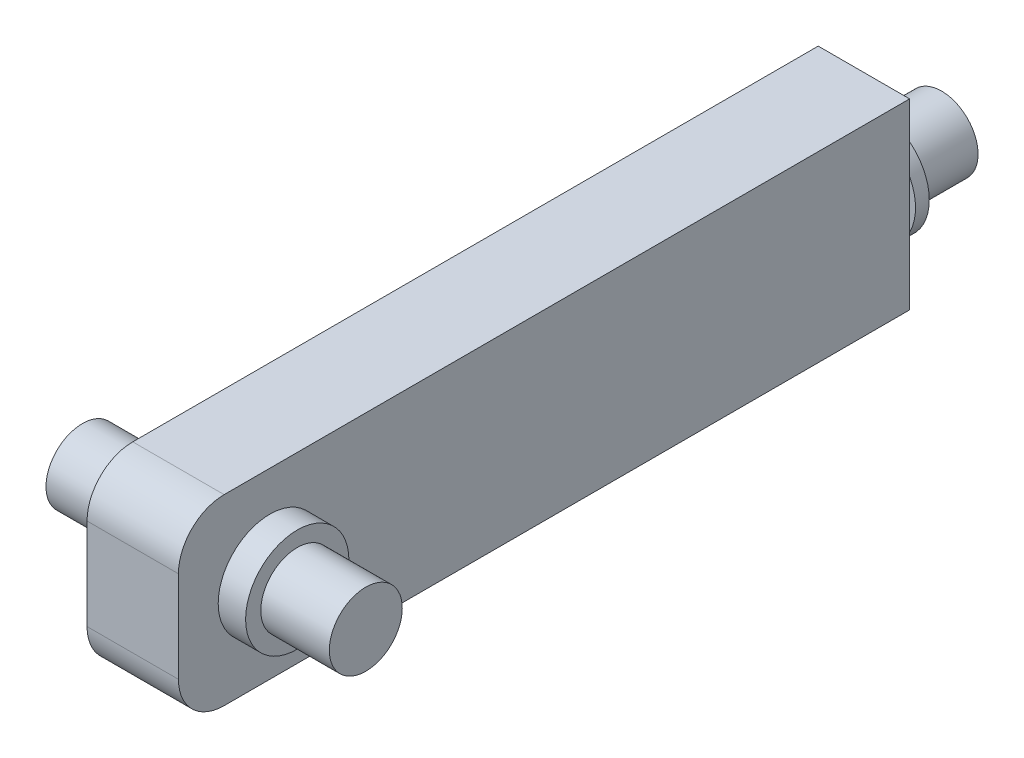
ISO-10303-21;
HEADER;
FILE_DESCRIPTION(('STEP AP214'),'2;1');
FILE_NAME('part.step','',(''),(''),'','','');
FILE_SCHEMA(('AUTOMOTIVE_DESIGN { 1 0 10303 214 1 1 1 1 }'));
ENDSEC;
DATA;
#1=APPLICATION_CONTEXT('core data for automotive mechanical design processes');
#2=APPLICATION_PROTOCOL_DEFINITION('international standard','automotive_design',2000,#1);
#3=PRODUCT_CONTEXT('',#1,'mechanical');
#4=PRODUCT('Part','Part','',(#3));
#5=PRODUCT_RELATED_PRODUCT_CATEGORY('part','',(#4));
#6=PRODUCT_DEFINITION_FORMATION('','',#4);
#7=PRODUCT_DEFINITION_CONTEXT('part definition',#1,'design');
#8=PRODUCT_DEFINITION('design','',#6,#7);
#9=PRODUCT_DEFINITION_SHAPE('','',#8);
#10=(LENGTH_UNIT() NAMED_UNIT(*) SI_UNIT(.MILLI.,.METRE.));
#11=(NAMED_UNIT(*) PLANE_ANGLE_UNIT() SI_UNIT($,.RADIAN.));
#12=(NAMED_UNIT(*) SI_UNIT($,.STERADIAN.) SOLID_ANGLE_UNIT());
#13=UNCERTAINTY_MEASURE_WITH_UNIT(LENGTH_MEASURE(1.E-05),#10,'distance_accuracy_value','');
#14=(GEOMETRIC_REPRESENTATION_CONTEXT(3) GLOBAL_UNCERTAINTY_ASSIGNED_CONTEXT((#13)) GLOBAL_UNIT_ASSIGNED_CONTEXT((#10,
#11,#12)) REPRESENTATION_CONTEXT('',''));
#15=CARTESIAN_POINT('',(0.,0.,0.));
#16=DIRECTION('',(0.,0.,1.));
#17=DIRECTION('',(1.,0.,0.));
#18=AXIS2_PLACEMENT_3D('',#15,#16,#17);
#19=CARTESIAN_POINT('',(0.,20.,-80.));
#20=DIRECTION('',(0.,0.,1.));
#21=DIRECTION('',(1.,0.,0.));
#22=AXIS2_PLACEMENT_3D('',#19,#20,#21);
#23=PLANE('',#22);
#24=CARTESIAN_POINT('',(5.,10.,-80.));
#25=DIRECTION('',(0.,0.,-1.));
#26=DIRECTION('',(-1.,0.,0.));
#27=AXIS2_PLACEMENT_3D('',#24,#25,#26);
#28=CIRCLE('',#27,5.65);
#29=CARTESIAN_POINT('',(10.,7.36893557661543,-80.));
#30=VERTEX_POINT('',#29);
#31=CARTESIAN_POINT('',(0.,7.36893557661543,-80.));
#32=VERTEX_POINT('',#31);
#33=EDGE_CURVE('E50',#30,#32,#28,.T.);
#34=ORIENTED_EDGE('',*,*,#33,.F.);
#35=DIRECTION('',(0.,-1.,0.));
#36=VECTOR('',#35,1.);
#37=CARTESIAN_POINT('',(10.,20.,-80.));
#38=LINE('',#37,#36);
#39=CARTESIAN_POINT('',(10.,0.,-80.));
#40=VERTEX_POINT('',#39);
#41=EDGE_CURVE('E110',#30,#40,#38,.T.);
#42=ORIENTED_EDGE('',*,*,#41,.T.);
#43=DIRECTION('',(-1.,0.,0.));
#44=VECTOR('',#43,1.);
#45=CARTESIAN_POINT('',(0.,0.,-80.));
#46=LINE('',#45,#44);
#47=CARTESIAN_POINT('',(0.,0.,-80.));
#48=VERTEX_POINT('',#47);
#49=EDGE_CURVE('E416',#40,#48,#46,.T.);
#50=ORIENTED_EDGE('',*,*,#49,.T.);
#51=DIRECTION('',(0.,-1.,0.));
#52=VECTOR('',#51,1.);
#53=CARTESIAN_POINT('',(0.,20.,-80.));
#54=LINE('',#53,#52);
#55=EDGE_CURVE('E55',#32,#48,#54,.T.);
#56=ORIENTED_EDGE('',*,*,#55,.F.);
#57=EDGE_LOOP('',(#34,#42,#50,#56));
#58=FACE_BOUND('',#57,.T.);
#59=ADVANCED_FACE('F35',(#58),#23,.F.);
#60=CARTESIAN_POINT('',(0.,20.,0.));
#61=DIRECTION('',(1.,0.,0.));
#62=DIRECTION('',(0.,0.,-1.));
#63=AXIS2_PLACEMENT_3D('',#60,#61,#62);
#64=PLANE('',#63);
#65=CARTESIAN_POINT('',(0.,10.,-10.));
#66=DIRECTION('',(1.,0.,0.));
#67=DIRECTION('',(0.,0.,-1.));
#68=AXIS2_PLACEMENT_3D('',#65,#66,#67);
#69=CIRCLE('',#68,5.65);
#70=CARTESIAN_POINT('',(0.,10.,-15.65));
#71=VERTEX_POINT('',#70);
#72=EDGE_CURVE('E11',#71,#71,#69,.F.);
#73=ORIENTED_EDGE('',*,*,#72,.F.);
#74=EDGE_LOOP('',(#73));
#75=FACE_BOUND('',#74,.T.);
#76=DIRECTION('',(0.,0.,1.));
#77=VECTOR('',#76,1.);
#78=CARTESIAN_POINT('',(0.,0.,0.));
#79=LINE('',#78,#77);
#80=CARTESIAN_POINT('',(0.,0.,-5.));
#81=VERTEX_POINT('',#80);
#82=EDGE_CURVE('E183',#48,#81,#79,.T.);
#83=ORIENTED_EDGE('',*,*,#82,.T.);
#84=CARTESIAN_POINT('',(0.,5.,-5.));
#85=DIRECTION('',(1.,0.,0.));
#86=DIRECTION('',(0.,0.,-1.));
#87=AXIS2_PLACEMENT_3D('',#84,#85,#86);
#88=CIRCLE('',#87,5.);
#89=CARTESIAN_POINT('',(0.,5.,0.));
#90=VERTEX_POINT('',#89);
#91=EDGE_CURVE('E186',#81,#90,#88,.F.);
#92=ORIENTED_EDGE('',*,*,#91,.T.);
#93=DIRECTION('',(0.,-1.,0.));
#94=VECTOR('',#93,1.);
#95=CARTESIAN_POINT('',(0.,20.,0.));
#96=LINE('',#95,#94);
#97=CARTESIAN_POINT('',(0.,15.,0.));
#98=VERTEX_POINT('',#97);
#99=EDGE_CURVE('E414',#98,#90,#96,.T.);
#100=ORIENTED_EDGE('',*,*,#99,.F.);
#101=CARTESIAN_POINT('',(0.,15.,-5.));
#102=DIRECTION('',(1.,0.,0.));
#103=DIRECTION('',(0.,0.,-1.));
#104=AXIS2_PLACEMENT_3D('',#101,#102,#103);
#105=CIRCLE('',#104,5.);
#106=CARTESIAN_POINT('',(0.,20.,-5.));
#107=VERTEX_POINT('',#106);
#108=EDGE_CURVE('E201',#98,#107,#105,.F.);
#109=ORIENTED_EDGE('',*,*,#108,.T.);
#110=DIRECTION('',(0.,0.,1.));
#111=VECTOR('',#110,1.);
#112=CARTESIAN_POINT('',(0.,20.,0.));
#113=LINE('',#112,#111);
#114=CARTESIAN_POINT('',(0.,20.,-80.));
#115=VERTEX_POINT('',#114);
#116=EDGE_CURVE('E413',#115,#107,#113,.T.);
#117=ORIENTED_EDGE('',*,*,#116,.F.);
#118=CARTESIAN_POINT('',(0.,12.6310644233846,-80.));
#119=VERTEX_POINT('',#118);
#120=EDGE_CURVE('E425',#115,#119,#54,.T.);
#121=ORIENTED_EDGE('',*,*,#120,.T.);
#122=DIRECTION('',(0.,1.,0.));
#123=VECTOR('',#122,1.);
#124=CARTESIAN_POINT('',(0.,20.,-80.));
#125=LINE('',#124,#123);
#126=EDGE_CURVE('E120',#32,#119,#125,.T.);
#127=ORIENTED_EDGE('',*,*,#126,.F.);
#128=ORIENTED_EDGE('',*,*,#55,.T.);
#129=EDGE_LOOP('',(#83,#92,#100,#109,#117,#121,#127,#128));
#130=FACE_BOUND('',#129,.T.);
#131=ADVANCED_FACE('F176',(#75,#130),#64,.F.);
#132=CARTESIAN_POINT('',(0.,20.,0.));
#133=DIRECTION('',(0.,0.,-1.));
#134=DIRECTION('',(-1.,0.,0.));
#135=AXIS2_PLACEMENT_3D('',#132,#133,#134);
#136=PLANE('',#135);
#137=ORIENTED_EDGE('',*,*,#99,.T.);
#138=DIRECTION('',(1.,0.,0.));
#139=VECTOR('',#138,1.);
#140=CARTESIAN_POINT('',(10.,5.,0.));
#141=LINE('',#140,#139);
#142=CARTESIAN_POINT('',(10.,5.,0.));
#143=VERTEX_POINT('',#142);
#144=EDGE_CURVE('E199',#90,#143,#141,.T.);
#145=ORIENTED_EDGE('',*,*,#144,.T.);
#146=DIRECTION('',(0.,-1.,0.));
#147=VECTOR('',#146,1.);
#148=CARTESIAN_POINT('',(10.,20.,0.));
#149=LINE('',#148,#147);
#150=CARTESIAN_POINT('',(10.,15.,0.));
#151=VERTEX_POINT('',#150);
#152=EDGE_CURVE('E109',#151,#143,#149,.T.);
#153=ORIENTED_EDGE('',*,*,#152,.F.);
#154=DIRECTION('',(1.,0.,0.));
#155=VECTOR('',#154,1.);
#156=CARTESIAN_POINT('',(0.,15.,0.));
#157=LINE('',#156,#155);
#158=EDGE_CURVE('E410',#151,#98,#157,.F.);
#159=ORIENTED_EDGE('',*,*,#158,.T.);
#160=EDGE_LOOP('',(#137,#145,#153,#159));
#161=FACE_BOUND('',#160,.T.);
#162=ADVANCED_FACE('F179',(#161),#136,.F.);
#163=CARTESIAN_POINT('',(10.,20.,0.));
#164=DIRECTION('',(-1.,0.,0.));
#165=DIRECTION('',(0.,0.,1.));
#166=AXIS2_PLACEMENT_3D('',#163,#164,#165);
#167=PLANE('',#166);
#168=CARTESIAN_POINT('',(10.,10.,-10.));
#169=DIRECTION('',(-1.,0.,0.));
#170=DIRECTION('',(0.,0.,1.));
#171=AXIS2_PLACEMENT_3D('',#168,#169,#170);
#172=CIRCLE('',#171,5.65);
#173=CARTESIAN_POINT('',(10.,10.,-4.35));
#174=VERTEX_POINT('',#173);
#175=EDGE_CURVE('E43',#174,#174,#172,.F.);
#176=ORIENTED_EDGE('',*,*,#175,.F.);
#177=EDGE_LOOP('',(#176));
#178=FACE_BOUND('',#177,.T.);
#179=ORIENTED_EDGE('',*,*,#152,.T.);
#180=CARTESIAN_POINT('',(10.,5.,-5.));
#181=DIRECTION('',(-1.,0.,0.));
#182=DIRECTION('',(0.,0.,1.));
#183=AXIS2_PLACEMENT_3D('',#180,#181,#182);
#184=CIRCLE('',#183,5.);
#185=CARTESIAN_POINT('',(10.,0.,-5.));
#186=VERTEX_POINT('',#185);
#187=EDGE_CURVE('E433',#143,#186,#184,.F.);
#188=ORIENTED_EDGE('',*,*,#187,.T.);
#189=DIRECTION('',(0.,0.,-1.));
#190=VECTOR('',#189,1.);
#191=CARTESIAN_POINT('',(10.,0.,0.));
#192=LINE('',#191,#190);
#193=EDGE_CURVE('E190',#186,#40,#192,.T.);
#194=ORIENTED_EDGE('',*,*,#193,.T.);
#195=ORIENTED_EDGE('',*,*,#41,.F.);
#196=DIRECTION('',(0.,-1.,0.));
#197=VECTOR('',#196,1.);
#198=CARTESIAN_POINT('',(10.,20.,-80.));
#199=LINE('',#198,#197);
#200=CARTESIAN_POINT('',(10.,12.6310644233846,-80.));
#201=VERTEX_POINT('',#200);
#202=EDGE_CURVE('E113',#201,#30,#199,.T.);
#203=ORIENTED_EDGE('',*,*,#202,.F.);
#204=CARTESIAN_POINT('',(10.,20.,-80.));
#205=VERTEX_POINT('',#204);
#206=EDGE_CURVE('E99',#205,#201,#38,.T.);
#207=ORIENTED_EDGE('',*,*,#206,.F.);
#208=DIRECTION('',(0.,0.,-1.));
#209=VECTOR('',#208,1.);
#210=CARTESIAN_POINT('',(10.,20.,0.));
#211=LINE('',#210,#209);
#212=CARTESIAN_POINT('',(10.,20.,-5.));
#213=VERTEX_POINT('',#212);
#214=EDGE_CURVE('E415',#213,#205,#211,.T.);
#215=ORIENTED_EDGE('',*,*,#214,.F.);
#216=CARTESIAN_POINT('',(10.,15.,-5.));
#217=DIRECTION('',(-1.,0.,0.));
#218=DIRECTION('',(0.,0.,1.));
#219=AXIS2_PLACEMENT_3D('',#216,#217,#218);
#220=CIRCLE('',#219,5.);
#221=EDGE_CURVE('E431',#213,#151,#220,.F.);
#222=ORIENTED_EDGE('',*,*,#221,.T.);
#223=EDGE_LOOP('',(#179,#188,#194,#195,#203,#207,#215,#222));
#224=FACE_BOUND('',#223,.T.);
#225=ADVANCED_FACE('F116',(#178,#224),#167,.F.);
#226=EDGE_CURVE('E104',#119,#201,#28,.T.);
#227=ORIENTED_EDGE('',*,*,#226,.F.);
#228=ORIENTED_EDGE('',*,*,#120,.F.);
#229=DIRECTION('',(-1.,0.,0.));
#230=VECTOR('',#229,1.);
#231=CARTESIAN_POINT('',(0.,20.,-80.));
#232=LINE('',#231,#230);
#233=EDGE_CURVE('E106',#205,#115,#232,.T.);
#234=ORIENTED_EDGE('',*,*,#233,.F.);
#235=ORIENTED_EDGE('',*,*,#206,.T.);
#236=EDGE_LOOP('',(#227,#228,#234,#235));
#237=FACE_BOUND('',#236,.T.);
#238=ADVANCED_FACE('F101',(#237),#23,.F.);
#239=CARTESIAN_POINT('',(0.,20.,0.));
#240=DIRECTION('',(0.,-1.,0.));
#241=DIRECTION('',(0.,0.,-1.));
#242=AXIS2_PLACEMENT_3D('',#239,#240,#241);
#243=PLANE('',#242);
#244=ORIENTED_EDGE('',*,*,#116,.T.);
#245=DIRECTION('',(1.,0.,0.));
#246=VECTOR('',#245,1.);
#247=CARTESIAN_POINT('',(0.,20.,-5.));
#248=LINE('',#247,#246);
#249=EDGE_CURVE('E200',#107,#213,#248,.T.);
#250=ORIENTED_EDGE('',*,*,#249,.T.);
#251=ORIENTED_EDGE('',*,*,#214,.T.);
#252=ORIENTED_EDGE('',*,*,#233,.T.);
#253=EDGE_LOOP('',(#244,#250,#251,#252));
#254=FACE_BOUND('',#253,.T.);
#255=ADVANCED_FACE('F221',(#254),#243,.F.);
#256=CARTESIAN_POINT('',(0.,0.,0.));
#257=DIRECTION('',(0.,-1.,0.));
#258=DIRECTION('',(0.,0.,-1.));
#259=AXIS2_PLACEMENT_3D('',#256,#257,#258);
#260=PLANE('',#259);
#261=ORIENTED_EDGE('',*,*,#193,.F.);
#262=DIRECTION('',(1.,0.,0.));
#263=VECTOR('',#262,1.);
#264=CARTESIAN_POINT('',(0.,0.,-5.));
#265=LINE('',#264,#263);
#266=EDGE_CURVE('E197',#186,#81,#265,.F.);
#267=ORIENTED_EDGE('',*,*,#266,.T.);
#268=ORIENTED_EDGE('',*,*,#82,.F.);
#269=ORIENTED_EDGE('',*,*,#49,.F.);
#270=EDGE_LOOP('',(#261,#267,#268,#269));
#271=FACE_BOUND('',#270,.T.);
#272=ADVANCED_FACE('F229',(#271),#260,.T.);
#273=CARTESIAN_POINT('',(0.,5.,-5.));
#274=DIRECTION('',(-1.,0.,0.));
#275=DIRECTION('',(0.,0.,1.));
#276=AXIS2_PLACEMENT_3D('',#273,#274,#275);
#277=CYLINDRICAL_SURFACE('',#276,5.);
#278=ORIENTED_EDGE('',*,*,#91,.F.);
#279=ORIENTED_EDGE('',*,*,#266,.F.);
#280=ORIENTED_EDGE('',*,*,#187,.F.);
#281=ORIENTED_EDGE('',*,*,#144,.F.);
#282=EDGE_LOOP('',(#278,#279,#280,#281));
#283=FACE_BOUND('',#282,.T.);
#284=ADVANCED_FACE('F196',(#283),#277,.T.);
#285=CARTESIAN_POINT('',(0.,15.,-5.));
#286=DIRECTION('',(1.,0.,0.));
#287=DIRECTION('',(0.,0.,-1.));
#288=AXIS2_PLACEMENT_3D('',#285,#286,#287);
#289=CYLINDRICAL_SURFACE('',#288,5.);
#290=ORIENTED_EDGE('',*,*,#108,.F.);
#291=ORIENTED_EDGE('',*,*,#158,.F.);
#292=ORIENTED_EDGE('',*,*,#221,.F.);
#293=ORIENTED_EDGE('',*,*,#249,.F.);
#294=EDGE_LOOP('',(#290,#291,#292,#293));
#295=FACE_BOUND('',#294,.T.);
#296=ADVANCED_FACE('F37',(#295),#289,.T.);
#297=CARTESIAN_POINT('',(5.,10.,-80.));
#298=DIRECTION('',(0.,0.,-1.));
#299=DIRECTION('',(-1.,0.,0.));
#300=AXIS2_PLACEMENT_3D('',#297,#298,#299);
#301=PLANE('',#300);
#302=EDGE_CURVE('E130',#32,#119,#28,.T.);
#303=ORIENTED_EDGE('',*,*,#302,.F.);
#304=ORIENTED_EDGE('',*,*,#126,.T.);
#305=EDGE_LOOP('',(#303,#304));
#306=FACE_BOUND('',#305,.T.);
#307=ADVANCED_FACE('F246',(#306),#301,.F.);
#308=CARTESIAN_POINT('',(5.,10.,-81.5));
#309=DIRECTION('',(0.,0.,1.));
#310=DIRECTION('',(1.,0.,0.));
#311=AXIS2_PLACEMENT_3D('',#308,#309,#310);
#312=CYLINDRICAL_SURFACE('',#311,5.65);
#313=CARTESIAN_POINT('',(5.,10.,-81.5));
#314=DIRECTION('',(0.,0.,-1.));
#315=DIRECTION('',(-1.,0.,0.));
#316=AXIS2_PLACEMENT_3D('',#313,#314,#315);
#317=CIRCLE('',#316,5.65);
#318=CARTESIAN_POINT('',(-0.649999999999999,10.,-81.5));
#319=VERTEX_POINT('',#318);
#320=EDGE_CURVE('E121',#319,#319,#317,.T.);
#321=ORIENTED_EDGE('',*,*,#320,.F.);
#322=EDGE_LOOP('',(#321));
#323=FACE_BOUND('',#322,.T.);
#324=ORIENTED_EDGE('',*,*,#226,.T.);
#325=EDGE_CURVE('E123',#201,#30,#28,.T.);
#326=ORIENTED_EDGE('',*,*,#325,.T.);
#327=ORIENTED_EDGE('',*,*,#33,.T.);
#328=ORIENTED_EDGE('',*,*,#302,.T.);
#329=EDGE_LOOP('',(#324,#326,#327,#328));
#330=FACE_BOUND('',#329,.T.);
#331=ADVANCED_FACE('F128',(#323,#330),#312,.T.);
#332=CARTESIAN_POINT('',(5.,10.,-81.5));
#333=DIRECTION('',(0.,0.,-1.));
#334=DIRECTION('',(-1.,0.,0.));
#335=AXIS2_PLACEMENT_3D('',#332,#333,#334);
#336=PLANE('',#335);
#337=CARTESIAN_POINT('',(5.,10.,-81.5));
#338=DIRECTION('',(0.,0.,-1.));
#339=DIRECTION('',(-1.,0.,0.));
#340=AXIS2_PLACEMENT_3D('',#337,#338,#339);
#341=CIRCLE('',#340,3.99);
#342=CARTESIAN_POINT('',(1.01,10.,-81.5));
#343=VERTEX_POINT('',#342);
#344=EDGE_CURVE('E208',#343,#343,#341,.T.);
#345=ORIENTED_EDGE('',*,*,#344,.F.);
#346=EDGE_LOOP('',(#345));
#347=FACE_BOUND('',#346,.T.);
#348=ORIENTED_EDGE('',*,*,#320,.T.);
#349=EDGE_LOOP('',(#348));
#350=FACE_BOUND('',#349,.T.);
#351=ADVANCED_FACE('F245',(#347,#350),#336,.T.);
#352=ORIENTED_EDGE('',*,*,#325,.F.);
#353=ORIENTED_EDGE('',*,*,#202,.T.);
#354=EDGE_LOOP('',(#352,#353));
#355=FACE_BOUND('',#354,.T.);
#356=ADVANCED_FACE('F124',(#355),#301,.F.);
#357=CARTESIAN_POINT('',(5.,10.,-88.5));
#358=DIRECTION('',(0.,0.,-1.));
#359=DIRECTION('',(-1.,0.,0.));
#360=AXIS2_PLACEMENT_3D('',#357,#358,#359);
#361=PLANE('',#360);
#362=CARTESIAN_POINT('',(5.,10.,-88.5));
#363=DIRECTION('',(0.,0.,-1.));
#364=DIRECTION('',(-1.,0.,0.));
#365=AXIS2_PLACEMENT_3D('',#362,#363,#364);
#366=CIRCLE('',#365,3.99);
#367=CARTESIAN_POINT('',(1.01,10.,-88.5));
#368=VERTEX_POINT('',#367);
#369=EDGE_CURVE('E191',#368,#368,#366,.T.);
#370=ORIENTED_EDGE('',*,*,#369,.T.);
#371=EDGE_LOOP('',(#370));
#372=FACE_BOUND('',#371,.T.);
#373=ADVANCED_FACE('F238',(#372),#361,.T.);
#374=CARTESIAN_POINT('',(5.,10.,-88.5));
#375=DIRECTION('',(0.,0.,1.));
#376=DIRECTION('',(1.,0.,0.));
#377=AXIS2_PLACEMENT_3D('',#374,#375,#376);
#378=CYLINDRICAL_SURFACE('',#377,3.99);
#379=ORIENTED_EDGE('',*,*,#344,.T.);
#380=EDGE_LOOP('',(#379));
#381=FACE_BOUND('',#380,.T.);
#382=ORIENTED_EDGE('',*,*,#369,.F.);
#383=EDGE_LOOP('',(#382));
#384=FACE_BOUND('',#383,.T.);
#385=ADVANCED_FACE('F235',(#381,#384),#378,.T.);
#386=CARTESIAN_POINT('',(13.,10.,-10.));
#387=DIRECTION('',(-1.,0.,0.));
#388=DIRECTION('',(0.,0.,1.));
#389=AXIS2_PLACEMENT_3D('',#386,#387,#388);
#390=CYLINDRICAL_SURFACE('',#389,5.65);
#391=CARTESIAN_POINT('',(13.,10.,-10.));
#392=DIRECTION('',(1.,0.,0.));
#393=DIRECTION('',(0.,0.,-1.));
#394=AXIS2_PLACEMENT_3D('',#391,#392,#393);
#395=CIRCLE('',#394,5.65);
#396=CARTESIAN_POINT('',(13.,10.,-15.65));
#397=VERTEX_POINT('',#396);
#398=EDGE_CURVE('E133',#397,#397,#395,.T.);
#399=ORIENTED_EDGE('',*,*,#398,.F.);
#400=EDGE_LOOP('',(#399));
#401=FACE_BOUND('',#400,.T.);
#402=ORIENTED_EDGE('',*,*,#175,.T.);
#403=EDGE_LOOP('',(#402));
#404=FACE_BOUND('',#403,.T.);
#405=ADVANCED_FACE('F213',(#401,#404),#390,.T.);
#406=CARTESIAN_POINT('',(13.,10.,-10.));
#407=DIRECTION('',(1.,0.,0.));
#408=DIRECTION('',(0.,0.,-1.));
#409=AXIS2_PLACEMENT_3D('',#406,#407,#408);
#410=PLANE('',#409);
#411=CARTESIAN_POINT('',(13.,10.,-10.));
#412=DIRECTION('',(1.,0.,0.));
#413=DIRECTION('',(0.,0.,-1.));
#414=AXIS2_PLACEMENT_3D('',#411,#412,#413);
#415=CIRCLE('',#414,3.99);
#416=CARTESIAN_POINT('',(13.,10.,-13.99));
#417=VERTEX_POINT('',#416);
#418=EDGE_CURVE('E140',#417,#417,#415,.T.);
#419=ORIENTED_EDGE('',*,*,#418,.F.);
#420=EDGE_LOOP('',(#419));
#421=FACE_BOUND('',#420,.T.);
#422=ORIENTED_EDGE('',*,*,#398,.T.);
#423=EDGE_LOOP('',(#422));
#424=FACE_BOUND('',#423,.T.);
#425=ADVANCED_FACE('F255',(#421,#424),#410,.T.);
#426=CARTESIAN_POINT('',(20.5,10.,-10.));
#427=DIRECTION('',(-1.,0.,0.));
#428=DIRECTION('',(0.,0.,1.));
#429=AXIS2_PLACEMENT_3D('',#426,#427,#428);
#430=CYLINDRICAL_SURFACE('',#429,3.99);
#431=CARTESIAN_POINT('',(20.5,10.,-10.));
#432=DIRECTION('',(1.,0.,0.));
#433=DIRECTION('',(0.,0.,-1.));
#434=AXIS2_PLACEMENT_3D('',#431,#432,#433);
#435=CIRCLE('',#434,3.99);
#436=CARTESIAN_POINT('',(20.5,10.,-13.99));
#437=VERTEX_POINT('',#436);
#438=EDGE_CURVE('E135',#437,#437,#435,.T.);
#439=ORIENTED_EDGE('',*,*,#438,.F.);
#440=EDGE_LOOP('',(#439));
#441=FACE_BOUND('',#440,.T.);
#442=ORIENTED_EDGE('',*,*,#418,.T.);
#443=EDGE_LOOP('',(#442));
#444=FACE_BOUND('',#443,.T.);
#445=ADVANCED_FACE('F259',(#441,#444),#430,.T.);
#446=CARTESIAN_POINT('',(20.5,10.,-10.));
#447=DIRECTION('',(1.,0.,0.));
#448=DIRECTION('',(0.,0.,-1.));
#449=AXIS2_PLACEMENT_3D('',#446,#447,#448);
#450=PLANE('',#449);
#451=ORIENTED_EDGE('',*,*,#438,.T.);
#452=EDGE_LOOP('',(#451));
#453=FACE_BOUND('',#452,.T.);
#454=ADVANCED_FACE('F172',(#453),#450,.T.);
#455=CARTESIAN_POINT('',(-3.,10.,-10.));
#456=DIRECTION('',(1.,0.,0.));
#457=DIRECTION('',(0.,0.,-1.));
#458=AXIS2_PLACEMENT_3D('',#455,#456,#457);
#459=CYLINDRICAL_SURFACE('',#458,5.65);
#460=CARTESIAN_POINT('',(-3.,10.,-10.));
#461=DIRECTION('',(-1.,0.,0.));
#462=DIRECTION('',(0.,0.,1.));
#463=AXIS2_PLACEMENT_3D('',#460,#461,#462);
#464=CIRCLE('',#463,5.65);
#465=CARTESIAN_POINT('',(-3.,10.,-4.35));
#466=VERTEX_POINT('',#465);
#467=EDGE_CURVE('E144',#466,#466,#464,.T.);
#468=ORIENTED_EDGE('',*,*,#467,.F.);
#469=EDGE_LOOP('',(#468));
#470=FACE_BOUND('',#469,.T.);
#471=ORIENTED_EDGE('',*,*,#72,.T.);
#472=EDGE_LOOP('',(#471));
#473=FACE_BOUND('',#472,.T.);
#474=ADVANCED_FACE('F166',(#470,#473),#459,.T.);
#475=CARTESIAN_POINT('',(-3.,10.,-10.));
#476=DIRECTION('',(-1.,0.,0.));
#477=DIRECTION('',(0.,0.,1.));
#478=AXIS2_PLACEMENT_3D('',#475,#476,#477);
#479=PLANE('',#478);
#480=CARTESIAN_POINT('',(-3.,10.,-10.));
#481=DIRECTION('',(-1.,0.,0.));
#482=DIRECTION('',(0.,0.,1.));
#483=AXIS2_PLACEMENT_3D('',#480,#481,#482);
#484=CIRCLE('',#483,3.99);
#485=CARTESIAN_POINT('',(-3.,10.,-6.01));
#486=VERTEX_POINT('',#485);
#487=EDGE_CURVE('E149',#486,#486,#484,.T.);
#488=ORIENTED_EDGE('',*,*,#487,.F.);
#489=EDGE_LOOP('',(#488));
#490=FACE_BOUND('',#489,.T.);
#491=ORIENTED_EDGE('',*,*,#467,.T.);
#492=EDGE_LOOP('',(#491));
#493=FACE_BOUND('',#492,.T.);
#494=ADVANCED_FACE('F160',(#490,#493),#479,.T.);
#495=CARTESIAN_POINT('',(-10.5,10.,-10.));
#496=DIRECTION('',(1.,0.,0.));
#497=DIRECTION('',(0.,0.,-1.));
#498=AXIS2_PLACEMENT_3D('',#495,#496,#497);
#499=CYLINDRICAL_SURFACE('',#498,3.99);
#500=CARTESIAN_POINT('',(-10.5,10.,-10.));
#501=DIRECTION('',(-1.,0.,0.));
#502=DIRECTION('',(0.,0.,1.));
#503=AXIS2_PLACEMENT_3D('',#500,#501,#502);
#504=CIRCLE('',#503,3.99);
#505=CARTESIAN_POINT('',(-10.5,10.,-6.01));
#506=VERTEX_POINT('',#505);
#507=EDGE_CURVE('E148',#506,#506,#504,.T.);
#508=ORIENTED_EDGE('',*,*,#507,.F.);
#509=EDGE_LOOP('',(#508));
#510=FACE_BOUND('',#509,.T.);
#511=ORIENTED_EDGE('',*,*,#487,.T.);
#512=EDGE_LOOP('',(#511));
#513=FACE_BOUND('',#512,.T.);
#514=ADVANCED_FACE('F157',(#510,#513),#499,.T.);
#515=CARTESIAN_POINT('',(-10.5,10.,-10.));
#516=DIRECTION('',(-1.,0.,0.));
#517=DIRECTION('',(0.,0.,1.));
#518=AXIS2_PLACEMENT_3D('',#515,#516,#517);
#519=PLANE('',#518);
#520=ORIENTED_EDGE('',*,*,#507,.T.);
#521=EDGE_LOOP('',(#520));
#522=FACE_BOUND('',#521,.T.);
#523=ADVANCED_FACE('F155',(#522),#519,.T.);
#524=CLOSED_SHELL('',(#59,#131,#162,#225,#238,#255,#272,#284,#296,#307,#331,#351,#356,#373,#385,
#405,#425,#445,#454,#474,#494,#514,#523));
#525=MANIFOLD_SOLID_BREP('B2',#524);
#526=ADVANCED_BREP_SHAPE_REPRESENTATION('',(#18,#525),#14);
#527=SHAPE_DEFINITION_REPRESENTATION(#9,#526);
ENDSEC;
END-ISO-10303-21;
